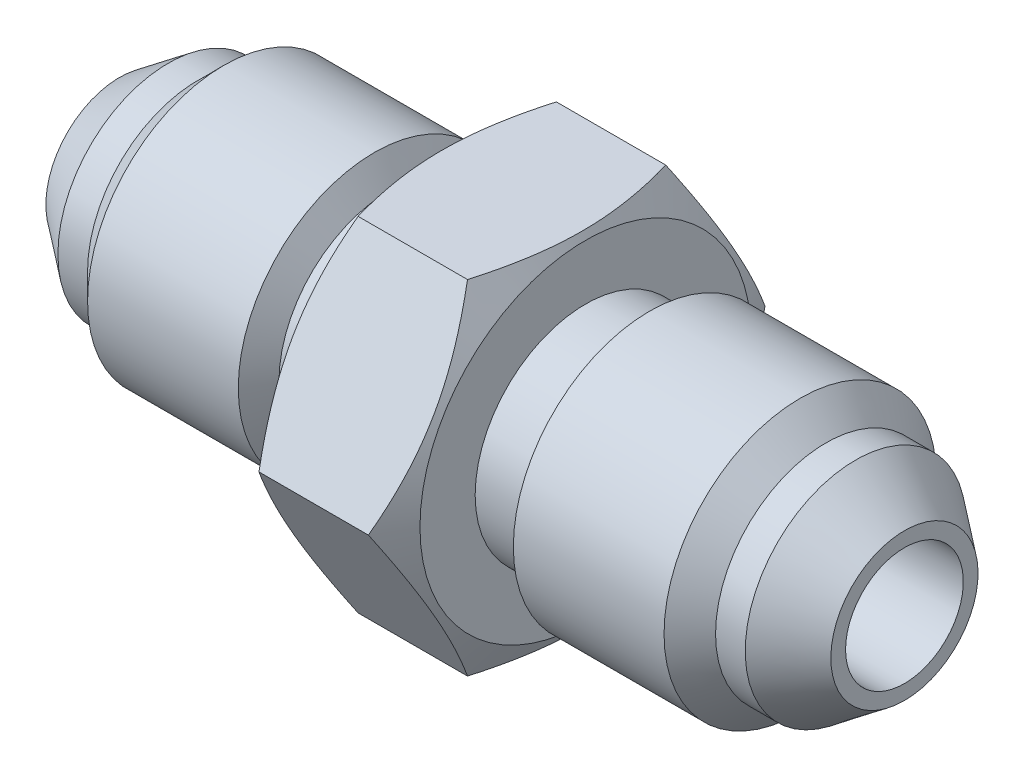
ISO-10303-21;
HEADER;
FILE_DESCRIPTION(('STEP AP214'),'2;1');
FILE_NAME('part.step','',(''),(''),'','','');
FILE_SCHEMA(('AUTOMOTIVE_DESIGN { 1 0 10303 214 1 1 1 1 }'));
ENDSEC;
DATA;
#1=APPLICATION_CONTEXT('core data for automotive mechanical design processes');
#2=APPLICATION_PROTOCOL_DEFINITION('international standard','automotive_design',2000,#1);
#3=PRODUCT_CONTEXT('',#1,'mechanical');
#4=PRODUCT('Part','Part','',(#3));
#5=PRODUCT_RELATED_PRODUCT_CATEGORY('part','',(#4));
#6=PRODUCT_DEFINITION_FORMATION('','',#4);
#7=PRODUCT_DEFINITION_CONTEXT('part definition',#1,'design');
#8=PRODUCT_DEFINITION('design','',#6,#7);
#9=PRODUCT_DEFINITION_SHAPE('','',#8);
#10=(LENGTH_UNIT() NAMED_UNIT(*) SI_UNIT(.MILLI.,.METRE.));
#11=(NAMED_UNIT(*) PLANE_ANGLE_UNIT() SI_UNIT($,.RADIAN.));
#12=(NAMED_UNIT(*) SI_UNIT($,.STERADIAN.) SOLID_ANGLE_UNIT());
#13=UNCERTAINTY_MEASURE_WITH_UNIT(LENGTH_MEASURE(1.E-05),#10,'distance_accuracy_value','');
#14=(GEOMETRIC_REPRESENTATION_CONTEXT(3) GLOBAL_UNCERTAINTY_ASSIGNED_CONTEXT((#13)) GLOBAL_UNIT_ASSIGNED_CONTEXT((#10,
#11,#12)) REPRESENTATION_CONTEXT('',''));
#15=CARTESIAN_POINT('',(0.,0.,0.));
#16=DIRECTION('',(0.,0.,1.));
#17=DIRECTION('',(1.,0.,0.));
#18=AXIS2_PLACEMENT_3D('',#15,#16,#17);
#19=CARTESIAN_POINT('',(16.,0.,8.08290376865476));
#20=DIRECTION('',(0.,0.5,-0.866025403784439));
#21=DIRECTION('',(0.,0.866025403784439,0.5));
#22=AXIS2_PLACEMENT_3D('',#19,#20,#21);
#23=PLANE('',#22);
#24=DIRECTION('',(1.,0.,0.));
#25=VECTOR('',#24,1.);
#26=CARTESIAN_POINT('',(16.,-7.,4.04145188432738));
#27=LINE('',#26,#25);
#28=CARTESIAN_POINT('',(13.7695523370859,-7.,4.04145184102993));
#29=VERTEX_POINT('',#28);
#30=CARTESIAN_POINT('',(18.2304476628624,-6.99999996250659,4.04145190597421));
#31=VERTEX_POINT('',#30);
#32=EDGE_CURVE('E295',#29,#31,#27,.T.);
#33=ORIENTED_EDGE('',*,*,#32,.T.);
#34=CARTESIAN_POINT('',(18.2304476503685,-1.15356977516488E-11,8.0829037686481));
#35=CARTESIAN_POINT('',(18.2817264954627,-0.153866219325046,7.99406906550825));
#36=CARTESIAN_POINT('',(18.3306779235275,-0.308306124341684,7.90490314477328));
#37=CARTESIAN_POINT('',(18.4232849576522,-0.618440130630472,7.72584719275759));
#38=CARTESIAN_POINT('',(18.4669382791793,-0.774134742289358,7.63595686680496));
#39=CARTESIAN_POINT('',(18.5890941562771,-1.24371126709583,7.36484673380281));
#40=CARTESIAN_POINT('',(18.6585739343247,-1.55944669874192,7.18255679734924));
#41=CARTESIAN_POINT('',(18.7400452111364,-2.03193898944481,6.9097632461219));
#42=CARTESIAN_POINT('',(18.7632536331217,-2.18728422905769,6.82007463021408));
#43=CARTESIAN_POINT('',(18.8021698335142,-2.49867653359645,6.64029219936505));
#44=CARTESIAN_POINT('',(18.8178782746178,-2.65472353528444,6.55019842093425));
#45=CARTESIAN_POINT('',(18.8413941802691,-2.96708846991515,6.36985444183981));
#46=CARTESIAN_POINT('',(18.8492106103787,-3.12340589288065,6.27960453561165));
#47=CARTESIAN_POINT('',(18.8567832825349,-3.43617639516258,6.09902640192461));
#48=CARTESIAN_POINT('',(18.8565397736774,-3.59262947013718,6.00869817697248));
#49=CARTESIAN_POINT('',(18.8447946057506,-4.02123301093532,5.76124380731705));
#50=CARTESIAN_POINT('',(18.8250874848616,-4.29324309393085,5.60419871267729));
#51=CARTESIAN_POINT('',(18.7626027747101,-4.83545664107243,5.29115157527683));
#52=CARTESIAN_POINT('',(18.7198038398557,-5.10565819912389,5.13515063300036));
#53=CARTESIAN_POINT('',(18.6128215710911,-5.64896245441752,4.82147377495472));
#54=CARTESIAN_POINT('',(18.5481850796382,-5.92199661615695,4.66383742817649));
#55=CARTESIAN_POINT('',(18.4014873393784,-6.46399382660115,4.35091519282651));
#56=CARTESIAN_POINT('',(18.319460536973,-6.73296381353289,4.19562529846754));
#57=CARTESIAN_POINT('',(18.2304476753599,-6.99999992501401,4.04145192762057));
#58=B_SPLINE_CURVE_WITH_KNOTS('',3,(#34,#35,#36,#37,#38,#39,#40,#41,#42,#43,#44,#45,#46,#47,#48,
#49,#50,#51,#52,#53,#54,#55,#56,#57),.UNSPECIFIED.,.F.,.F.,(4,2,2,2,2,2,2,2,2,2,2,4),(0.,
0.554720009595271,1.10967836987024,2.22190068891676,2.76439120730583,3.30683378249756,
3.84865943088992,4.39046833393637,5.3336024400705,6.27760985712302,7.24255083439344,
8.20559804000231),.UNSPECIFIED.);
#59=CARTESIAN_POINT('',(18.2304476503824,0.,8.08290376862228));
#60=VERTEX_POINT('',#59);
#61=EDGE_CURVE('E97',#60,#31,#58,.T.);
#62=ORIENTED_EDGE('',*,*,#61,.F.);
#63=DIRECTION('',(1.,0.,0.));
#64=VECTOR('',#63,1.);
#65=CARTESIAN_POINT('',(16.,0.,8.08290376865476));
#66=LINE('',#65,#64);
#67=CARTESIAN_POINT('',(13.7695523495787,6.48040305394074E-13,8.08290376864702));
#68=VERTEX_POINT('',#67);
#69=EDGE_CURVE('E41',#60,#68,#66,.F.);
#70=ORIENTED_EDGE('',*,*,#69,.T.);
#71=CARTESIAN_POINT('',(13.7695523592075,-7.00000002886832,4.04145186766026));
#72=CARTESIAN_POINT('',(13.7182735137119,-6.84613380930403,4.13028657094489));
#73=CARTESIAN_POINT('',(13.6693220852363,-6.69169390403535,4.21945249182538));
#74=CARTESIAN_POINT('',(13.5767150502729,-6.38155989723726,4.39850844413511));
#75=CARTESIAN_POINT('',(13.5330617283179,-6.22586528532111,4.48839877023627));
#76=CARTESIAN_POINT('',(13.4109058499072,-5.75628875971213,4.75950890370175));
#77=CARTESIAN_POINT('',(13.3414260709535,-5.44055332750909,4.94179884047687));
#78=CARTESIAN_POINT('',(13.2599547927973,-4.96806103598366,5.2145923921791));
#79=CARTESIAN_POINT('',(13.236746370374,-4.81271579612705,5.30428100822764));
#80=CARTESIAN_POINT('',(13.197830169109,-4.50132349108596,5.4840634393667));
#81=CARTESIAN_POINT('',(13.1821217275709,-4.34527648913936,5.5741572179468));
#82=CARTESIAN_POINT('',(13.1586058210656,-4.03291155397928,5.75450119734687));
#83=CARTESIAN_POINT('',(13.1507893905362,-3.87659413074306,5.84475110373133));
#84=CARTESIAN_POINT('',(13.1432167175647,-3.56382362790359,6.02532923774027));
#85=CARTESIAN_POINT('',(13.1434602260266,-3.40737055264216,6.11565746285801));
#86=CARTESIAN_POINT('',(13.1552053931302,-2.97876700338247,6.36311183739872));
#87=CARTESIAN_POINT('',(13.1749125143184,-2.70675691220732,6.52015693676098));
#88=CARTESIAN_POINT('',(13.237397226455,-2.16454334880752,6.83320408354812));
#89=CARTESIAN_POINT('',(13.2801961629985,-1.89434178267775,6.98920503048861));
#90=CARTESIAN_POINT('',(13.387178436349,-1.35103751101682,7.30288189798392));
#91=CARTESIAN_POINT('',(13.4518149307422,-1.07800334099597,7.46051824954342));
#92=CARTESIAN_POINT('',(13.5985126777315,-0.536006114279575,7.77344049428816));
#93=CARTESIAN_POINT('',(13.6805394839213,-0.267036119356034,7.9287303932612));
#94=CARTESIAN_POINT('',(13.7695523495852,1.29671934576626E-12,8.08290376865551));
#95=B_SPLINE_CURVE_WITH_KNOTS('',3,(#71,#72,#73,#74,#75,#76,#77,#78,#79,#80,#81,#82,#83,#84,#85,
#86,#87,#88,#89,#90,#91,#92,#93,#94),.UNSPECIFIED.,.F.,.F.,(4,2,2,2,2,2,2,2,2,2,2,4),(0.,
0.55472001076405,1.10967837220852,2.22190069366378,2.76439121305882,3.30683378925624,
3.84865943863906,4.39046834267801,5.33360247705425,6.27760992245441,7.24255092955945,
8.20559816478391),.UNSPECIFIED.);
#96=EDGE_CURVE('E135',#29,#68,#95,.T.);
#97=ORIENTED_EDGE('',*,*,#96,.F.);
#98=EDGE_LOOP('',(#33,#62,#70,#97));
#99=FACE_BOUND('',#98,.T.);
#100=ADVANCED_FACE('F16',(#99),#23,.F.);
#101=CARTESIAN_POINT('',(16.,-7.,4.04145188432738));
#102=DIRECTION('',(0.,1.,0.));
#103=DIRECTION('',(0.,0.,1.));
#104=AXIS2_PLACEMENT_3D('',#101,#102,#103);
#105=PLANE('',#104);
#106=DIRECTION('',(1.,0.,0.));
#107=VECTOR('',#106,1.);
#108=CARTESIAN_POINT('',(16.,-7.,-4.04145188432738));
#109=LINE('',#108,#107);
#110=CARTESIAN_POINT('',(13.7695523370863,-6.99999996250471,-4.0414519059753));
#111=VERTEX_POINT('',#110);
#112=CARTESIAN_POINT('',(18.2304476628672,-7.,-4.04145184101723));
#113=VERTEX_POINT('',#112);
#114=EDGE_CURVE('E82',#111,#113,#109,.T.);
#115=ORIENTED_EDGE('',*,*,#114,.T.);
#116=CARTESIAN_POINT('',(18.2304476407473,-7.,4.041451917643));
#117=CARTESIAN_POINT('',(18.281726486238,-7.,3.8637825110881));
#118=CARTESIAN_POINT('',(18.3306779147091,-7.,3.68545066934159));
#119=CARTESIAN_POINT('',(18.4232849496644,-7.,3.32733876475137));
#120=CARTESIAN_POINT('',(18.4669382716158,-7.,3.14755811256381));
#121=CARTESIAN_POINT('',(18.5890941500166,-7.,2.60533784568121));
#122=CARTESIAN_POINT('',(18.658573928966,-7.,2.240757972165));
#123=CARTESIAN_POINT('',(18.7400452071252,-7.,1.6951708687809));
#124=CARTESIAN_POINT('',(18.7632536295521,-7.,1.51579363666973));
#125=CARTESIAN_POINT('',(18.8021698308233,-7.,1.15622877436326));
#126=CARTESIAN_POINT('',(18.817878272364,-7.,0.976041217188774));
#127=CARTESIAN_POINT('',(18.8413941788736,-7.,0.615353258358378));
#128=CARTESIAN_POINT('',(18.8492106094046,-7.,0.434853445573471));
#129=CARTESIAN_POINT('',(18.8567832823775,-7.,0.0736971775237484));
#130=CARTESIAN_POINT('',(18.8565397739155,-7.,-0.106959272727564));
#131=CARTESIAN_POINT('',(18.8447946069862,-7.,-0.601868014509689));
#132=CARTESIAN_POINT('',(18.8250874865452,-7.,-0.915958205928632));
#133=CARTESIAN_POINT('',(18.7626027769315,-7.,-1.54205248501494));
#134=CARTESIAN_POINT('',(18.7198038421662,-7.,-1.85405437171381));
#135=CARTESIAN_POINT('',(18.6128215732497,-7.,-2.48140809217345));
#136=CARTESIAN_POINT('',(18.5481850815444,-7.,-2.7966807879507));
#137=CARTESIAN_POINT('',(18.4014873405155,-7.,-3.42252526302388));
#138=CARTESIAN_POINT('',(18.3194605375947,-7.,-3.73310505389445));
#139=CARTESIAN_POINT('',(18.2304476753697,-7.,-4.04145179770707));
#140=B_SPLINE_CURVE_WITH_KNOTS('',3,(#116,#117,#118,#119,#120,#121,#122,#123,#124,#125,#126,
#127,#128,#129,#130,#131,#132,#133,#134,#135,#136,#137,#138,#139),.UNSPECIFIED.,.F.,.F.,(4,2,2,
2,2,2,2,2,2,2,2,4),(0.,0.554720010718581,1.1096783721175,2.22190069347039,2.76439121290875,
3.3068337891494,3.84865943858057,4.39046834266596,5.33360245509866,6.27760987847407,
7.24255086241014,8.20559807464209),.UNSPECIFIED.);
#141=EDGE_CURVE('E99',#31,#113,#140,.T.);
#142=ORIENTED_EDGE('',*,*,#141,.F.);
#143=ORIENTED_EDGE('',*,*,#32,.F.);
#144=CARTESIAN_POINT('',(13.7695523592066,-7.,-4.04145191765842));
#145=CARTESIAN_POINT('',(13.718273513715,-7.,-3.86378251110321));
#146=CARTESIAN_POINT('',(13.6693220852432,-7.,-3.68545066935638));
#147=CARTESIAN_POINT('',(13.5767150502863,-7.,-3.32733876476546));
#148=CARTESIAN_POINT('',(13.5330617283341,-7.,-3.14755811257754));
#149=CARTESIAN_POINT('',(13.4109058499312,-7.,-2.60533784569376));
#150=CARTESIAN_POINT('',(13.3414260709806,-7.,-2.24075797217667));
#151=CARTESIAN_POINT('',(13.2599547928199,-7.,-1.69517086879128));
#152=CARTESIAN_POINT('',(13.2367463703925,-7.,-1.51579363667976));
#153=CARTESIAN_POINT('',(13.1978301691204,-7.,-1.15622877437255));
#154=CARTESIAN_POINT('',(13.1821217275794,-7.,-0.976041217197687));
#155=CARTESIAN_POINT('',(13.1586058210693,-7.,-0.615353258366522));
#156=CARTESIAN_POINT('',(13.1507893905381,-7.,-0.434853445581225));
#157=CARTESIAN_POINT('',(13.1432167175648,-7.,-0.0736971775307135));
#158=CARTESIAN_POINT('',(13.1434602260267,-7.,0.106959272720997));
#159=CARTESIAN_POINT('',(13.1552053929559,-7.,0.601868014506136));
#160=CARTESIAN_POINT('',(13.1749125133973,-7.,0.915958205927689));
#161=CARTESIAN_POINT('',(13.2373972230124,-7.,1.54205248501914));
#162=CARTESIAN_POINT('',(13.2801961577786,-7.,1.85405437172055));
#163=CARTESIAN_POINT('',(13.3871784266976,-7.,2.4814080921854));
#164=CARTESIAN_POINT('',(13.4518149184045,-7.,2.79668078796532));
#165=CARTESIAN_POINT('',(13.5985126594369,-7.,3.42252526304365));
#166=CARTESIAN_POINT('',(13.6805394623598,-7.,3.73310505391671));
#167=CARTESIAN_POINT('',(13.7695523245867,-7.,4.04145179773171));
#168=B_SPLINE_CURVE_WITH_KNOTS('',3,(#144,#145,#146,#147,#148,#149,#150,#151,#152,#153,#154,
#155,#156,#157,#158,#159,#160,#161,#162,#163,#164,#165,#166,#167),.UNSPECIFIED.,.F.,.F.,(4,2,2,
2,2,2,2,2,2,2,2,4),(0.,0.554720010720157,1.10967837212066,2.22190069347682,2.7643912129164,
3.30683378915827,3.84865943859064,4.39046834267721,5.33360245511775,6.27760987850105,
7.24255086244591,8.20559807468652),.UNSPECIFIED.);
#169=EDGE_CURVE('E91',#111,#29,#168,.T.);
#170=ORIENTED_EDGE('',*,*,#169,.F.);
#171=EDGE_LOOP('',(#115,#142,#143,#170));
#172=FACE_BOUND('',#171,.T.);
#173=ADVANCED_FACE('F145',(#172),#105,.F.);
#174=CARTESIAN_POINT('',(16.,-7.,-4.04145188432738));
#175=DIRECTION('',(0.,0.5,0.866025403784439));
#176=DIRECTION('',(0.,-0.866025403784439,0.5));
#177=AXIS2_PLACEMENT_3D('',#174,#175,#176);
#178=PLANE('',#177);
#179=DIRECTION('',(1.,0.,0.));
#180=VECTOR('',#179,1.);
#181=CARTESIAN_POINT('',(16.,0.,-8.08290376865477));
#182=LINE('',#181,#180);
#183=CARTESIAN_POINT('',(13.7695523495549,-6.47908393741804E-13,-8.08290376862266));
#184=VERTEX_POINT('',#183);
#185=CARTESIAN_POINT('',(18.2304476503608,-5.76637454499392E-12,-8.08290376864331));
#186=VERTEX_POINT('',#185);
#187=EDGE_CURVE('E70',#184,#186,#182,.T.);
#188=ORIENTED_EDGE('',*,*,#187,.T.);
#189=CARTESIAN_POINT('',(18.2304476407503,-7.00000002884298,-4.04145186767488));
#190=CARTESIAN_POINT('',(18.281726486245,-6.84613380927906,-4.1302865709593));
#191=CARTESIAN_POINT('',(18.3306779147196,-6.69169390401076,-4.21945249183957));
#192=CARTESIAN_POINT('',(18.4232849496811,-6.38155989721347,-4.39850844414885));
#193=CARTESIAN_POINT('',(18.4669382716352,-6.22586528529773,-4.48839877024977));
#194=CARTESIAN_POINT('',(18.5890941500432,-5.75628875969009,-4.75950890371447));
#195=CARTESIAN_POINT('',(18.6585739289953,-5.44055332748803,-4.94179884048904));
#196=CARTESIAN_POINT('',(18.7400452071494,-4.96806103596404,-5.21459239219043));
#197=CARTESIAN_POINT('',(18.7632536295721,-4.81271579610785,-5.30428100823873));
#198=CARTESIAN_POINT('',(18.8021698308359,-4.50132349106761,-5.48406343937729));
#199=CARTESIAN_POINT('',(18.8178782723735,-4.34527648912145,-5.57415721795714));
#200=CARTESIAN_POINT('',(18.8413941788779,-4.03291155396228,-5.75450119735669));
#201=CARTESIAN_POINT('',(18.8492106094068,-3.87659413072652,-5.84475110374089));
#202=CARTESIAN_POINT('',(18.8567832823777,-3.56382362788797,-6.02532923774929));
#203=CARTESIAN_POINT('',(18.8565397739155,-3.40737055262701,-6.11565746286676));
#204=CARTESIAN_POINT('',(18.8447946068114,-2.9787670033701,-6.36311183740586));
#205=CARTESIAN_POINT('',(18.8250874856233,-2.70675691219728,-6.52015693676679));
#206=CARTESIAN_POINT('',(18.7626027734875,-2.16454334880205,-6.83320408355129));
#207=CARTESIAN_POINT('',(18.7198038369447,-1.89434178267453,-6.98920503049047));
#208=CARTESIAN_POINT('',(18.6128215635963,-1.35103751101827,-7.30288189798308));
#209=CARTESIAN_POINT('',(18.5481850692045,-1.07800334099981,-7.46051824954121));
#210=CARTESIAN_POINT('',(18.4014873222184,-0.536006114288037,-7.77344049428328));
#211=CARTESIAN_POINT('',(18.3194605160304,-0.267036119366719,-7.92873039325503));
#212=CARTESIAN_POINT('',(18.2304476503685,-1.15335406622005E-11,-8.0829037686481));
#213=B_SPLINE_CURVE_WITH_KNOTS('',3,(#189,#190,#191,#192,#193,#194,#195,#196,#197,#198,#199,
#200,#201,#202,#203,#204,#205,#206,#207,#208,#209,#210,#211,#212),.UNSPECIFIED.,.F.,.F.,(4,2,2,
2,2,2,2,2,2,2,2,4),(0.,0.55472001076201,1.10967837220444,2.22190069365547,2.76439121304886,
3.30683378924462,3.8486594386258,4.39046834266313,5.3336024770314,6.27760992242354,
7.24255092951965,8.20559816473529),.UNSPECIFIED.);
#214=EDGE_CURVE('E157',#113,#186,#213,.T.);
#215=ORIENTED_EDGE('',*,*,#214,.F.);
#216=ORIENTED_EDGE('',*,*,#114,.F.);
#217=CARTESIAN_POINT('',(13.7695523495852,1.29712221933932E-12,-8.08290376865551));
#218=CARTESIAN_POINT('',(13.7182735044902,-0.153866219312472,-7.99406906551552));
#219=CARTESIAN_POINT('',(13.6693220764246,-0.308306124329385,-7.90490314478038));
#220=CARTESIAN_POINT('',(13.5767150422983,-0.618440130618754,-7.72584719276436));
#221=CARTESIAN_POINT('',(13.5330617207705,-0.774134742277946,-7.63595686681155));
#222=CARTESIAN_POINT('',(13.4109058436706,-1.24371126708542,-7.36484673380883));
#223=CARTESIAN_POINT('',(13.3414260656218,-1.55944669873225,-7.18255679735483));
#224=CARTESIAN_POINT('',(13.2599547888085,-2.03193898943623,-6.90976324612686));
#225=CARTESIAN_POINT('',(13.2367463668228,-2.18728422904942,-6.82007463021886));
#226=CARTESIAN_POINT('',(13.1978301664296,-2.49867653358881,-6.64029219936946));
#227=CARTESIAN_POINT('',(13.1821217253256,-2.65472353527713,-6.55019842093848));
#228=CARTESIAN_POINT('',(13.1586058196737,-2.96708846990851,-6.36985444184365));
#229=CARTESIAN_POINT('',(13.1507893895639,-3.12340589287435,-6.2796045356153));
#230=CARTESIAN_POINT('',(13.1432167174074,-3.43617639515695,-6.09902640192786));
#231=CARTESIAN_POINT('',(13.1434602262648,-3.59262947013191,-6.00869817697553));
#232=CARTESIAN_POINT('',(13.1552053941915,-4.02123301093036,-5.76124380731992));
#233=CARTESIAN_POINT('',(13.1749125150806,-4.29324309392586,-5.60419871268017));
#234=CARTESIAN_POINT('',(13.2373972252326,-4.83545664106735,-5.29115157527977));
#235=CARTESIAN_POINT('',(13.2801961600872,-5.10565819911876,-5.13515063300333));
#236=CARTESIAN_POINT('',(13.3871784288528,-5.64896245441235,-4.8214737749577));
#237=CARTESIAN_POINT('',(13.4518149203063,-5.9219966161518,-4.66383742817947));
#238=CARTESIAN_POINT('',(13.5985126605676,-6.46399382659594,-4.35091519282952));
#239=CARTESIAN_POINT('',(13.6805394629737,-6.7329638135276,-4.1956252984706));
#240=CARTESIAN_POINT('',(13.7695523245876,-6.99999992500861,-4.04145192762368));
#241=B_SPLINE_CURVE_WITH_KNOTS('',3,(#217,#218,#219,#220,#221,#222,#223,#224,#225,#226,#227,
#228,#229,#230,#231,#232,#233,#234,#235,#236,#237,#238,#239,#240),.UNSPECIFIED.,.F.,.F.,(4,2,2,
2,2,2,2,2,2,2,2,4),(0.,0.554720009596814,1.10967836987333,2.22190068892304,2.76439120731334,
3.30683378250628,3.84865943089984,4.39046833394748,5.3336024400815,6.27760985713395,
7.24255083440477,8.20559804001399),.UNSPECIFIED.);
#242=EDGE_CURVE('E20',#184,#111,#241,.T.);
#243=ORIENTED_EDGE('',*,*,#242,.F.);
#244=EDGE_LOOP('',(#188,#215,#216,#243));
#245=FACE_BOUND('',#244,.T.);
#246=ADVANCED_FACE('F86',(#245),#178,.F.);
#247=CARTESIAN_POINT('',(16.,0.,-8.08290376865477));
#248=DIRECTION('',(0.,-0.5,0.866025403784439));
#249=DIRECTION('',(0.,-0.866025403784439,-0.5));
#250=AXIS2_PLACEMENT_3D('',#247,#248,#249);
#251=PLANE('',#250);
#252=DIRECTION('',(1.,0.,0.));
#253=VECTOR('',#252,1.);
#254=CARTESIAN_POINT('',(16.,7.,-4.04145188432774));
#255=LINE('',#254,#253);
#256=CARTESIAN_POINT('',(13.7695523370828,7.,-4.04145184101941));
#257=VERTEX_POINT('',#256);
#258=CARTESIAN_POINT('',(18.2304476628679,6.99999996248992,-4.04145190598402));
#259=VERTEX_POINT('',#258);
#260=EDGE_CURVE('E81',#257,#259,#255,.T.);
#261=ORIENTED_EDGE('',*,*,#260,.T.);
#262=CARTESIAN_POINT('',(18.2304476503685,1.15359756411225E-11,-8.08290376864811));
#263=CARTESIAN_POINT('',(18.2817264954627,0.15386621932504,-7.99406906550827));
#264=CARTESIAN_POINT('',(18.3306779235275,0.308306124341674,-7.90490314477329));
#265=CARTESIAN_POINT('',(18.4232849576522,0.618440130630451,-7.72584719275761));
#266=CARTESIAN_POINT('',(18.4669382791793,0.774134742289331,-7.63595686680498));
#267=CARTESIAN_POINT('',(18.5890941562771,1.24371126709579,-7.36484673380285));
#268=CARTESIAN_POINT('',(18.6585739343247,1.55944669874186,-7.18255679734928));
#269=CARTESIAN_POINT('',(18.7400452111364,2.03193898944474,-6.90976324612195));
#270=CARTESIAN_POINT('',(18.7632536331217,2.18728422905764,-6.82007463021412));
#271=CARTESIAN_POINT('',(18.8021698335142,2.49867653359641,-6.64029219936508));
#272=CARTESIAN_POINT('',(18.8178782746178,2.6547235352844,-6.55019842093428));
#273=CARTESIAN_POINT('',(18.8413941802691,2.96708846991513,-6.36985444183984));
#274=CARTESIAN_POINT('',(18.8492106103787,3.12340589288063,-6.27960453561167));
#275=CARTESIAN_POINT('',(18.8567832825349,3.43617639516257,-6.09902640192462));
#276=CARTESIAN_POINT('',(18.8565397736774,3.59262947013718,-6.00869817697248));
#277=CARTESIAN_POINT('',(18.8447946057507,4.02123301093244,-5.76124380731871));
#278=CARTESIAN_POINT('',(18.825087484862,4.29324309392508,-5.60419871268062));
#279=CARTESIAN_POINT('',(18.7626027747116,4.83545664106095,-5.29115157528347));
#280=CARTESIAN_POINT('',(18.7198038398581,5.10565819910958,-5.13515063300863));
#281=CARTESIAN_POINT('',(18.6128215710955,5.64896245439748,-4.82147377496629));
#282=CARTESIAN_POINT('',(18.5481850796439,5.92199661613402,-4.66383742818974));
#283=CARTESIAN_POINT('',(18.4014873393867,6.46399382657253,-4.35091519284304));
#284=CARTESIAN_POINT('',(18.3194605369829,6.73296381350147,-4.19562529848569));
#285=CARTESIAN_POINT('',(18.2304476753713,6.99999992497984,-4.04145192764029));
#286=B_SPLINE_CURVE_WITH_KNOTS('',3,(#262,#263,#264,#265,#266,#267,#268,#269,#270,#271,#272,
#273,#274,#275,#276,#277,#278,#279,#280,#281,#282,#283,#284,#285),.UNSPECIFIED.,.F.,.F.,(4,2,2,
2,2,2,2,2,2,2,2,4),(0.,0.554720009595252,1.1096783698702,2.22190068891667,2.76439120730577,
3.30683378249751,3.84865943088991,4.39046833393638,5.33360244006051,6.277609857103,
7.24255083436287,8.20559803996126),.UNSPECIFIED.);
#287=EDGE_CURVE('E78',#186,#259,#286,.T.);
#288=ORIENTED_EDGE('',*,*,#287,.F.);
#289=ORIENTED_EDGE('',*,*,#187,.F.);
#290=CARTESIAN_POINT('',(13.7695523592011,7.00000002884908,-4.04145186767137));
#291=CARTESIAN_POINT('',(13.7182735137057,6.84613380928495,-4.13028657095591));
#292=CARTESIAN_POINT('',(13.6693220852304,6.69169390401643,-4.21945249183631));
#293=CARTESIAN_POINT('',(13.5767150502676,6.38155989721866,-4.39850844414586));
#294=CARTESIAN_POINT('',(13.5330617283128,6.22586528530267,-4.48839877024693));
#295=CARTESIAN_POINT('',(13.4109058499031,5.7562887596942,-4.75950890371211));
#296=CARTESIAN_POINT('',(13.3414260709499,5.44055332749151,-4.94179884048703));
#297=CARTESIAN_POINT('',(13.2599547927946,4.96806103596662,-5.21459239218895));
#298=CARTESIAN_POINT('',(13.2367463703716,4.81271579611018,-5.30428100823739));
#299=CARTESIAN_POINT('',(13.1978301691072,4.50132349106944,-5.48406343937624));
#300=CARTESIAN_POINT('',(13.1821217275693,4.34527648912302,-5.57415721795624));
#301=CARTESIAN_POINT('',(13.1586058210647,4.03291155396331,-5.7545011973561));
#302=CARTESIAN_POINT('',(13.1507893905356,3.87659413072728,-5.84475110374045));
#303=CARTESIAN_POINT('',(13.1432167175646,3.5638236278882,-6.02532923774917));
#304=CARTESIAN_POINT('',(13.1434602260267,3.40737055262697,-6.11565746286678));
#305=CARTESIAN_POINT('',(13.155205393131,2.9787670033687,-6.36311183740666));
#306=CARTESIAN_POINT('',(13.1749125143195,2.7067569121948,-6.52015693676822));
#307=CARTESIAN_POINT('',(13.2373972264565,2.16454334879748,-6.83320408355393));
#308=CARTESIAN_POINT('',(13.2801961630001,1.89434178266894,-6.9892050304937));
#309=CARTESIAN_POINT('',(13.3871784363504,1.35103751101054,-7.30288189798755));
#310=CARTESIAN_POINT('',(13.4518149307435,1.07800334099097,-7.46051824954632));
#311=CARTESIAN_POINT('',(13.5985126777323,0.536006114277108,-7.7734404942896));
#312=CARTESIAN_POINT('',(13.6805394839217,0.267036119354811,-7.92873039326192));
#313=CARTESIAN_POINT('',(13.7695523495852,-1.29613152601982E-12,-8.08290376865552));
#314=B_SPLINE_CURVE_WITH_KNOTS('',3,(#290,#291,#292,#293,#294,#295,#296,#297,#298,#299,#300,
#301,#302,#303,#304,#305,#306,#307,#308,#309,#310,#311,#312,#313),.UNSPECIFIED.,.F.,.F.,(4,2,2,
2,2,2,2,2,2,2,2,4),(0.,0.5547200107633,1.10967837220703,2.22190069366074,2.76439121305509,
3.30683378925181,3.84865943863393,4.39046834267219,5.33360247704423,6.27760992244017,
7.24255092954076,8.20559816476079),.UNSPECIFIED.);
#315=EDGE_CURVE('E75',#257,#184,#314,.T.);
#316=ORIENTED_EDGE('',*,*,#315,.F.);
#317=EDGE_LOOP('',(#261,#288,#289,#316));
#318=FACE_BOUND('',#317,.T.);
#319=ADVANCED_FACE('F73',(#318),#251,.F.);
#320=CARTESIAN_POINT('',(16.,7.,-4.04145188432738));
#321=DIRECTION('',(0.,-1.,0.));
#322=DIRECTION('',(0.,0.,-1.));
#323=AXIS2_PLACEMENT_3D('',#320,#321,#322);
#324=PLANE('',#323);
#325=DIRECTION('',(1.,0.,0.));
#326=VECTOR('',#325,1.);
#327=CARTESIAN_POINT('',(16.,7.,4.04145188432738));
#328=LINE('',#327,#326);
#329=CARTESIAN_POINT('',(13.7695523370828,6.99999996249425,4.04145190598134));
#330=VERTEX_POINT('',#329);
#331=CARTESIAN_POINT('',(18.2304476628674,7.,4.04145184101661));
#332=VERTEX_POINT('',#331);
#333=EDGE_CURVE('E300',#330,#332,#328,.T.);
#334=ORIENTED_EDGE('',*,*,#333,.T.);
#335=CARTESIAN_POINT('',(18.2304476407487,7.,-4.04145191763787));
#336=CARTESIAN_POINT('',(18.2817264862394,7.,-3.86378251108301));
#337=CARTESIAN_POINT('',(18.3306779147104,7.,-3.68545066933655));
#338=CARTESIAN_POINT('',(18.4232849496656,7.,-3.32733876474641));
#339=CARTESIAN_POINT('',(18.466938271617,7.,-3.14755811255889));
#340=CARTESIAN_POINT('',(18.5890941500176,7.,-2.60533784567643));
#341=CARTESIAN_POINT('',(18.6585739289668,7.,-2.24075797216032));
#342=CARTESIAN_POINT('',(18.7400452071258,7.,-1.69517086877636));
#343=CARTESIAN_POINT('',(18.7632536295526,7.,-1.51579363666523));
#344=CARTESIAN_POINT('',(18.8021698308238,7.,-1.15622877435885));
#345=CARTESIAN_POINT('',(18.8178782723644,7.,-0.97604121718442));
#346=CARTESIAN_POINT('',(18.8413941788738,7.,-0.615353258354122));
#347=CARTESIAN_POINT('',(18.8492106094047,7.,-0.434853445569266));
#348=CARTESIAN_POINT('',(18.8567832823776,7.,-0.0736971775196463));
#349=CARTESIAN_POINT('',(18.8565397739154,7.,0.106959272731613));
#350=CARTESIAN_POINT('',(18.844794606986,7.,0.601868014513254));
#351=CARTESIAN_POINT('',(18.8250874865449,7.,0.915958205931764));
#352=CARTESIAN_POINT('',(18.7626027769312,7.,1.54205248501721));
#353=CARTESIAN_POINT('',(18.7198038421659,7.,1.85405437171564));
#354=CARTESIAN_POINT('',(18.6128215732495,7.,2.4814080921744));
#355=CARTESIAN_POINT('',(18.5481850815443,7.,2.7966807879512));
#356=CARTESIAN_POINT('',(18.4014873405156,7.,3.4225252630235));
#357=CARTESIAN_POINT('',(18.3194605375949,7.,3.73310505389365));
#358=CARTESIAN_POINT('',(18.2304476753701,7.,4.04145179770583));
#359=B_SPLINE_CURVE_WITH_KNOTS('',3,(#335,#336,#337,#338,#339,#340,#341,#342,#343,#344,#345,
#346,#347,#348,#349,#350,#351,#352,#353,#354,#355,#356,#357,#358),.UNSPECIFIED.,.F.,.F.,(4,2,2,
2,2,2,2,2,2,2,2,4),(0.,0.55472001071841,1.10967837211716,2.22190069346969,2.76439121290789,
3.30683378914838,3.84865943857939,4.39046834266462,5.33360245509603,6.27760987847015,
7.24255086240487,8.20559807463547),.UNSPECIFIED.);
#360=EDGE_CURVE('E169',#259,#332,#359,.T.);
#361=ORIENTED_EDGE('',*,*,#360,.F.);
#362=ORIENTED_EDGE('',*,*,#260,.F.);
#363=CARTESIAN_POINT('',(13.769552359201,7.,4.04145191763897));
#364=CARTESIAN_POINT('',(13.7182735137097,7.,3.86378251108392));
#365=CARTESIAN_POINT('',(13.669322085238,7.,3.68545066933726));
#366=CARTESIAN_POINT('',(13.5767150502817,7.,3.32733876474668));
#367=CARTESIAN_POINT('',(13.5330617283297,7.,3.14755811255892));
#368=CARTESIAN_POINT('',(13.4109058499276,7.,2.60533784567566));
#369=CARTESIAN_POINT('',(13.3414260709774,7.,2.24075797215893));
#370=CARTESIAN_POINT('',(13.2599547928175,7.,1.69517086877409));
#371=CARTESIAN_POINT('',(13.2367463703904,7.,1.51579363666274));
#372=CARTESIAN_POINT('',(13.1978301691189,7.,1.15622877435588));
#373=CARTESIAN_POINT('',(13.1821217275781,7.,0.976041217181199));
#374=CARTESIAN_POINT('',(13.1586058210685,7.,0.615353258350401));
#375=CARTESIAN_POINT('',(13.1507893905375,7.,0.434853445565292));
#376=CARTESIAN_POINT('',(13.1432167175647,7.,0.0736971775151664));
#377=CARTESIAN_POINT('',(13.1434602260269,7.,-0.106959272736346));
#378=CARTESIAN_POINT('',(13.1552053929566,7.,-0.601868014518302));
#379=CARTESIAN_POINT('',(13.1749125133981,7.,-0.915958205936865));
#380=CARTESIAN_POINT('',(13.2373972230128,7.,-1.54205248502236));
#381=CARTESIAN_POINT('',(13.2801961577787,7.,-1.8540543717208));
#382=CARTESIAN_POINT('',(13.3871784266965,7.,-2.48140809217964));
#383=CARTESIAN_POINT('',(13.4518149184027,7.,-2.79668078795652));
#384=CARTESIAN_POINT('',(13.5985126594333,7.,-3.42252526302886));
#385=CARTESIAN_POINT('',(13.680539462355,7.,-3.73310505389897));
#386=CARTESIAN_POINT('',(13.7695523245808,7.,-4.04145179771107));
#387=B_SPLINE_CURVE_WITH_KNOTS('',3,(#363,#364,#365,#366,#367,#368,#369,#370,#371,#372,#373,
#374,#375,#376,#377,#378,#379,#380,#381,#382,#383,#384,#385,#386),.UNSPECIFIED.,.F.,.F.,(4,2,2,
2,2,2,2,2,2,2,2,4),(0.,0.554720010719493,1.10967837211933,2.22190069347412,2.7643912129131,
3.30683378915437,3.84865943858614,4.39046834267212,5.33360245510375,6.27760987847811,
7.24255086241355,8.20559807464482),.UNSPECIFIED.);
#388=EDGE_CURVE('E96',#330,#257,#387,.T.);
#389=ORIENTED_EDGE('',*,*,#388,.F.);
#390=EDGE_LOOP('',(#334,#361,#362,#389));
#391=FACE_BOUND('',#390,.T.);
#392=ADVANCED_FACE('F181',(#391),#324,.F.);
#393=CARTESIAN_POINT('',(16.,7.,4.04145188432738));
#394=DIRECTION('',(0.,-0.5,-0.866025403784439));
#395=DIRECTION('',(0.,0.866025403784439,-0.5));
#396=AXIS2_PLACEMENT_3D('',#393,#394,#395);
#397=PLANE('',#396);
#398=ORIENTED_EDGE('',*,*,#69,.F.);
#399=CARTESIAN_POINT('',(18.23044764075,7.00000002884405,4.04145186767426));
#400=CARTESIAN_POINT('',(18.2817264862446,6.84613380928012,4.13028657095869));
#401=CARTESIAN_POINT('',(18.3306779147193,6.69169390401181,4.21945249183897));
#402=CARTESIAN_POINT('',(18.4232849496808,6.3815598972145,4.39850844414825));
#403=CARTESIAN_POINT('',(18.4669382716349,6.22586528529876,4.48839877024918));
#404=CARTESIAN_POINT('',(18.589094150043,5.75628875969109,4.7595089037139));
#405=CARTESIAN_POINT('',(18.6585739289951,5.440553327489,4.94179884048847));
#406=CARTESIAN_POINT('',(18.7400452071492,4.96806103596499,5.21459239218989));
#407=CARTESIAN_POINT('',(18.7632536295719,4.81271579610878,5.30428100823819));
#408=CARTESIAN_POINT('',(18.8021698308358,4.50132349106853,5.48406343937676));
#409=CARTESIAN_POINT('',(18.8178782723734,4.34527648912236,5.57415721795662));
#410=CARTESIAN_POINT('',(18.8413941788778,4.03291155396316,5.75450119735618));
#411=CARTESIAN_POINT('',(18.8492106094068,3.87659413072739,5.84475110374038));
#412=CARTESIAN_POINT('',(18.8567832823777,3.56382362788883,6.0253292377488));
#413=CARTESIAN_POINT('',(18.8565397739156,3.40737055262785,6.11565746286627));
#414=CARTESIAN_POINT('',(18.8447946068115,2.97876700337086,6.36311183740542));
#415=CARTESIAN_POINT('',(18.8250874856234,2.70675691219797,6.52015693676638));
#416=CARTESIAN_POINT('',(18.7626027734876,2.16454334880261,6.83320408355096));
#417=CARTESIAN_POINT('',(18.7198038369448,1.89434178267503,6.98920503049018));
#418=CARTESIAN_POINT('',(18.6128215635964,1.35103751101862,7.30288189798288));
#419=CARTESIAN_POINT('',(18.5481850692045,1.07800334100009,7.46051824954105));
#420=CARTESIAN_POINT('',(18.4014873222184,0.536006114288173,7.7734404942832));
#421=CARTESIAN_POINT('',(18.3194605160304,0.267036119366785,7.92873039325499));
#422=CARTESIAN_POINT('',(18.2304476503685,1.15317161495098E-11,8.0829037686481));
#423=B_SPLINE_CURVE_WITH_KNOTS('',3,(#399,#400,#401,#402,#403,#404,#405,#406,#407,#408,#409,
#410,#411,#412,#413,#414,#415,#416,#417,#418,#419,#420,#421,#422),.UNSPECIFIED.,.F.,.F.,(4,2,2,
2,2,2,2,2,2,2,2,4),(0.,0.554720010762051,1.10967837220452,2.22190069365564,2.76439121304907,
3.30683378924487,3.84865943862609,4.39046834266345,5.33360247703196,6.27760992242433,
7.24255092952069,8.20559816473658),.UNSPECIFIED.);
#424=EDGE_CURVE('E175',#332,#60,#423,.T.);
#425=ORIENTED_EDGE('',*,*,#424,.F.);
#426=ORIENTED_EDGE('',*,*,#333,.F.);
#427=CARTESIAN_POINT('',(13.7695523495852,-1.2986827048557E-12,8.08290376865551));
#428=CARTESIAN_POINT('',(13.7182735044902,0.153866219312468,7.99406906551552));
#429=CARTESIAN_POINT('',(13.6693220764246,0.308306124329377,7.90490314478039));
#430=CARTESIAN_POINT('',(13.5767150422983,0.61844013061874,7.72584719276437));
#431=CARTESIAN_POINT('',(13.5330617207705,0.774134742277929,7.63595686681156));
#432=CARTESIAN_POINT('',(13.4109058436706,1.24371126708539,7.36484673380884));
#433=CARTESIAN_POINT('',(13.3414260656218,1.55944669873221,7.18255679735485));
#434=CARTESIAN_POINT('',(13.2599547888085,2.03193898943619,6.90976324612689));
#435=CARTESIAN_POINT('',(13.2367463668229,2.18728422904938,6.82007463021888));
#436=CARTESIAN_POINT('',(13.1978301664296,2.49867653358878,6.64029219936948));
#437=CARTESIAN_POINT('',(13.1821217253256,2.65472353527711,6.55019842093849));
#438=CARTESIAN_POINT('',(13.1586058196737,2.96708846990849,6.36985444184366));
#439=CARTESIAN_POINT('',(13.1507893895639,3.12340589287433,6.27960453561531));
#440=CARTESIAN_POINT('',(13.1432167174074,3.43617639515695,6.09902640192786));
#441=CARTESIAN_POINT('',(13.1434602262648,3.5926294701319,6.00869817697553));
#442=CARTESIAN_POINT('',(13.1552053941915,4.02123301092866,5.7612438073209));
#443=CARTESIAN_POINT('',(13.1749125150804,4.29324309392246,5.60419871268213));
#444=CARTESIAN_POINT('',(13.2373972252316,4.83545664106059,5.29115157528367));
#445=CARTESIAN_POINT('',(13.2801961600858,5.10565819911033,5.13515063300819));
#446=CARTESIAN_POINT('',(13.3871784288502,5.64896245440055,4.82147377496452));
#447=CARTESIAN_POINT('',(13.451814920303,5.92199661613829,4.66383742818727));
#448=CARTESIAN_POINT('',(13.5985126605626,6.46399382657908,4.35091519283925));
#449=CARTESIAN_POINT('',(13.6805394629679,6.7329638135091,4.19562529848128));
#450=CARTESIAN_POINT('',(13.7695523245809,6.99999992498849,4.0414519276353));
#451=B_SPLINE_CURVE_WITH_KNOTS('',3,(#427,#428,#429,#430,#431,#432,#433,#434,#435,#436,#437,
#438,#439,#440,#441,#442,#443,#444,#445,#446,#447,#448,#449,#450),.UNSPECIFIED.,.F.,.F.,(4,2,2,
2,2,2,2,2,2,2,2,4),(0.,0.554720009596802,1.10967836987331,2.22190068892299,2.7643912073133,
3.30683378250625,3.84865943089983,4.39046833394748,5.33360244007562,6.27760985712216,
7.24255083438677,8.20559803998982),.UNSPECIFIED.);
#452=EDGE_CURVE('E101',#68,#330,#451,.T.);
#453=ORIENTED_EDGE('',*,*,#452,.F.);
#454=EDGE_LOOP('',(#398,#425,#426,#453));
#455=FACE_BOUND('',#454,.T.);
#456=ADVANCED_FACE('F125',(#455),#397,.F.);
#457=CARTESIAN_POINT('',(13.7741696636908,0.,0.));
#458=DIRECTION('',(1.,0.,0.));
#459=DIRECTION('',(0.,0.,-1.));
#460=AXIS2_PLACEMENT_3D('',#457,#458,#459);
#461=CONICAL_SURFACE('',#460,8.09090119128086,1.04719755119076);
#462=CARTESIAN_POINT('',(12.9999999999768,0.,0.));
#463=DIRECTION('',(1.,0.,0.));
#464=DIRECTION('',(0.,0.,-1.));
#465=AXIS2_PLACEMENT_3D('',#462,#463,#464);
#466=CIRCLE('',#465,6.75000000006776);
#467=CARTESIAN_POINT('',(12.9999999999768,0.,-6.75000000006776));
#468=VERTEX_POINT('',#467);
#469=EDGE_CURVE('E276',#468,#468,#466,.T.);
#470=ORIENTED_EDGE('',*,*,#469,.T.);
#471=EDGE_LOOP('',(#470));
#472=FACE_BOUND('',#471,.T.);
#473=ORIENTED_EDGE('',*,*,#388,.T.);
#474=ORIENTED_EDGE('',*,*,#315,.T.);
#475=ORIENTED_EDGE('',*,*,#242,.T.);
#476=ORIENTED_EDGE('',*,*,#169,.T.);
#477=ORIENTED_EDGE('',*,*,#96,.T.);
#478=ORIENTED_EDGE('',*,*,#452,.T.);
#479=EDGE_LOOP('',(#473,#474,#475,#476,#477,#478));
#480=FACE_BOUND('',#479,.T.);
#481=ADVANCED_FACE('F93',(#472,#480),#461,.T.);
#482=CARTESIAN_POINT('',(18.2258303362915,0.,0.));
#483=DIRECTION('',(-1.,0.,0.));
#484=DIRECTION('',(0.,0.,1.));
#485=AXIS2_PLACEMENT_3D('',#482,#483,#484);
#486=CONICAL_SURFACE('',#485,8.09090119122402,1.04719755119568);
#487=ORIENTED_EDGE('',*,*,#214,.T.);
#488=ORIENTED_EDGE('',*,*,#287,.T.);
#489=ORIENTED_EDGE('',*,*,#360,.T.);
#490=ORIENTED_EDGE('',*,*,#424,.T.);
#491=ORIENTED_EDGE('',*,*,#61,.T.);
#492=ORIENTED_EDGE('',*,*,#141,.T.);
#493=EDGE_LOOP('',(#487,#488,#489,#490,#491,#492));
#494=FACE_BOUND('',#493,.T.);
#495=CARTESIAN_POINT('',(19.0000000000295,0.,0.));
#496=DIRECTION('',(-1.,0.,0.));
#497=DIRECTION('',(0.,0.,1.));
#498=AXIS2_PLACEMENT_3D('',#495,#496,#497);
#499=CIRCLE('',#498,6.74999999995407);
#500=CARTESIAN_POINT('',(19.0000000000295,0.,6.74999999995407));
#501=VERTEX_POINT('',#500);
#502=EDGE_CURVE('E277',#501,#501,#499,.T.);
#503=ORIENTED_EDGE('',*,*,#502,.T.);
#504=EDGE_LOOP('',(#503));
#505=FACE_BOUND('',#504,.T.);
#506=ADVANCED_FACE('F124',(#494,#505),#486,.T.);
#507=CARTESIAN_POINT('',(13.,0.,-8.08290376865477));
#508=DIRECTION('',(1.,0.,0.));
#509=DIRECTION('',(0.,0.,-1.));
#510=AXIS2_PLACEMENT_3D('',#507,#508,#509);
#511=PLANE('',#510);
#512=CARTESIAN_POINT('',(13.,0.,0.));
#513=DIRECTION('',(1.,0.,0.));
#514=DIRECTION('',(0.,0.,-1.));
#515=AXIS2_PLACEMENT_3D('',#512,#513,#514);
#516=CIRCLE('',#515,4.5);
#517=CARTESIAN_POINT('',(13.,0.,-4.5));
#518=VERTEX_POINT('',#517);
#519=EDGE_CURVE('E273',#518,#518,#516,.F.);
#520=ORIENTED_EDGE('',*,*,#519,.F.);
#521=EDGE_LOOP('',(#520));
#522=FACE_BOUND('',#521,.T.);
#523=ORIENTED_EDGE('',*,*,#469,.F.);
#524=EDGE_LOOP('',(#523));
#525=FACE_BOUND('',#524,.T.);
#526=ADVANCED_FACE('F261',(#522,#525),#511,.F.);
#527=CARTESIAN_POINT('',(19.,0.,-8.08290376865477));
#528=DIRECTION('',(-1.,0.,0.));
#529=DIRECTION('',(0.,0.,1.));
#530=AXIS2_PLACEMENT_3D('',#527,#528,#529);
#531=PLANE('',#530);
#532=CARTESIAN_POINT('',(19.,0.,0.));
#533=DIRECTION('',(-1.,0.,0.));
#534=DIRECTION('',(0.,0.,1.));
#535=AXIS2_PLACEMENT_3D('',#532,#533,#534);
#536=CIRCLE('',#535,4.5);
#537=CARTESIAN_POINT('',(19.,0.,4.5));
#538=VERTEX_POINT('',#537);
#539=EDGE_CURVE('E282',#538,#538,#536,.F.);
#540=ORIENTED_EDGE('',*,*,#539,.F.);
#541=EDGE_LOOP('',(#540));
#542=FACE_BOUND('',#541,.T.);
#543=ORIENTED_EDGE('',*,*,#502,.F.);
#544=EDGE_LOOP('',(#543));
#545=FACE_BOUND('',#544,.T.);
#546=ADVANCED_FACE('F258',(#542,#545),#531,.F.);
#547=CARTESIAN_POINT('',(11.,0.,0.));
#548=DIRECTION('',(1.,0.,0.));
#549=DIRECTION('',(0.,0.,-1.));
#550=AXIS2_PLACEMENT_3D('',#547,#548,#549);
#551=CYLINDRICAL_SURFACE('',#550,4.5);
#552=ORIENTED_EDGE('',*,*,#519,.T.);
#553=EDGE_LOOP('',(#552));
#554=FACE_BOUND('',#553,.T.);
#555=CARTESIAN_POINT('',(11.0000000000241,0.,0.));
#556=DIRECTION('',(-1.,0.,0.));
#557=DIRECTION('',(0.,0.,-1.));
#558=AXIS2_PLACEMENT_3D('',#555,#556,#557);
#559=CIRCLE('',#558,4.50000000006412);
#560=CARTESIAN_POINT('',(11.0000000000241,0.,-4.50000000006412));
#561=VERTEX_POINT('',#560);
#562=EDGE_CURVE('E285',#561,#561,#559,.T.);
#563=ORIENTED_EDGE('',*,*,#562,.F.);
#564=EDGE_LOOP('',(#563));
#565=FACE_BOUND('',#564,.T.);
#566=ADVANCED_FACE('F254',(#554,#565),#551,.T.);
#567=CARTESIAN_POINT('',(21.,0.,0.));
#568=DIRECTION('',(-1.,0.,0.));
#569=DIRECTION('',(0.,0.,1.));
#570=AXIS2_PLACEMENT_3D('',#567,#568,#569);
#571=CYLINDRICAL_SURFACE('',#570,4.5);
#572=CARTESIAN_POINT('',(21.000000000015,0.,0.));
#573=DIRECTION('',(1.,0.,0.));
#574=DIRECTION('',(0.,0.,-1.));
#575=AXIS2_PLACEMENT_3D('',#572,#573,#574);
#576=CIRCLE('',#575,4.49999999995043);
#577=CARTESIAN_POINT('',(21.000000000015,0.,-4.49999999995043));
#578=VERTEX_POINT('',#577);
#579=EDGE_CURVE('E305',#578,#578,#576,.T.);
#580=ORIENTED_EDGE('',*,*,#579,.F.);
#581=EDGE_LOOP('',(#580));
#582=FACE_BOUND('',#581,.T.);
#583=ORIENTED_EDGE('',*,*,#539,.T.);
#584=EDGE_LOOP('',(#583));
#585=FACE_BOUND('',#584,.T.);
#586=ADVANCED_FACE('F250',(#582,#585),#571,.T.);
#587=CARTESIAN_POINT('',(10.3937822174203,0.,0.));
#588=DIRECTION('',(-1.,0.,0.));
#589=DIRECTION('',(0.,0.,1.));
#590=AXIS2_PLACEMENT_3D('',#587,#588,#589);
#591=CONICAL_SURFACE('',#590,5.54999999997108,1.04719755119057);
#592=ORIENTED_EDGE('',*,*,#562,.T.);
#593=EDGE_LOOP('',(#592));
#594=FACE_BOUND('',#593,.T.);
#595=CARTESIAN_POINT('',(10.3937822173509,0.,0.));
#596=DIRECTION('',(-1.,0.,0.));
#597=DIRECTION('',(0.,0.,1.));
#598=AXIS2_PLACEMENT_3D('',#595,#596,#597);
#599=CIRCLE('',#598,5.55);
#600=CARTESIAN_POINT('',(10.3937822173509,0.,5.55));
#601=VERTEX_POINT('',#600);
#602=EDGE_CURVE('E308',#601,#601,#599,.T.);
#603=ORIENTED_EDGE('',*,*,#602,.F.);
#604=EDGE_LOOP('',(#603));
#605=FACE_BOUND('',#604,.T.);
#606=ADVANCED_FACE('F246',(#594,#605),#591,.T.);
#607=CARTESIAN_POINT('',(21.606217782562,0.,0.));
#608=DIRECTION('',(1.,0.,0.));
#609=DIRECTION('',(0.,0.,-1.));
#610=AXIS2_PLACEMENT_3D('',#607,#608,#609);
#611=CONICAL_SURFACE('',#610,5.54999999980055,1.04719755119685);
#612=CARTESIAN_POINT('',(21.6062177826491,0.,0.));
#613=DIRECTION('',(1.,0.,0.));
#614=DIRECTION('',(0.,0.,-1.));
#615=AXIS2_PLACEMENT_3D('',#612,#613,#614);
#616=CIRCLE('',#615,5.55);
#617=CARTESIAN_POINT('',(21.6062177826491,0.,-5.55));
#618=VERTEX_POINT('',#617);
#619=EDGE_CURVE('E311',#618,#618,#616,.T.);
#620=ORIENTED_EDGE('',*,*,#619,.F.);
#621=EDGE_LOOP('',(#620));
#622=FACE_BOUND('',#621,.T.);
#623=ORIENTED_EDGE('',*,*,#579,.T.);
#624=EDGE_LOOP('',(#623));
#625=FACE_BOUND('',#624,.T.);
#626=ADVANCED_FACE('F242',(#622,#625),#611,.T.);
#627=CARTESIAN_POINT('',(13.,0.,0.));
#628=DIRECTION('',(-1.,0.,0.));
#629=DIRECTION('',(0.,0.,1.));
#630=AXIS2_PLACEMENT_3D('',#627,#628,#629);
#631=CYLINDRICAL_SURFACE('',#630,5.55);
#632=CARTESIAN_POINT('',(4.25000000001319,0.,0.));
#633=DIRECTION('',(1.,0.,0.));
#634=DIRECTION('',(0.,0.,1.));
#635=AXIS2_PLACEMENT_3D('',#632,#633,#634);
#636=CIRCLE('',#635,5.55000000008477);
#637=CARTESIAN_POINT('',(4.25000000001319,0.,5.55000000008477));
#638=VERTEX_POINT('',#637);
#639=EDGE_CURVE('E314',#638,#638,#636,.F.);
#640=ORIENTED_EDGE('',*,*,#639,.F.);
#641=EDGE_LOOP('',(#640));
#642=FACE_BOUND('',#641,.T.);
#643=ORIENTED_EDGE('',*,*,#602,.T.);
#644=EDGE_LOOP('',(#643));
#645=FACE_BOUND('',#644,.T.);
#646=ADVANCED_FACE('F238',(#642,#645),#631,.T.);
#647=CARTESIAN_POINT('',(19.,0.,0.));
#648=DIRECTION('',(1.,0.,0.));
#649=DIRECTION('',(0.,0.,-1.));
#650=AXIS2_PLACEMENT_3D('',#647,#648,#649);
#651=CYLINDRICAL_SURFACE('',#650,5.55);
#652=ORIENTED_EDGE('',*,*,#619,.T.);
#653=EDGE_LOOP('',(#652));
#654=FACE_BOUND('',#653,.T.);
#655=CARTESIAN_POINT('',(27.7500000000259,0.,0.));
#656=DIRECTION('',(-1.,0.,0.));
#657=DIRECTION('',(0.,0.,1.));
#658=AXIS2_PLACEMENT_3D('',#655,#656,#657);
#659=CIRCLE('',#658,5.54999999997108);
#660=CARTESIAN_POINT('',(27.7500000000259,0.,5.54999999997108));
#661=VERTEX_POINT('',#660);
#662=EDGE_CURVE('E317',#661,#661,#659,.F.);
#663=ORIENTED_EDGE('',*,*,#662,.F.);
#664=EDGE_LOOP('',(#663));
#665=FACE_BOUND('',#664,.T.);
#666=ADVANCED_FACE('F234',(#654,#665),#651,.T.);
#667=CARTESIAN_POINT('',(4.25000000001319,0.,0.));
#668=DIRECTION('',(1.,0.,0.));
#669=DIRECTION('',(0.,0.,-1.));
#670=AXIS2_PLACEMENT_3D('',#667,#668,#669);
#671=CONICAL_SURFACE('',#670,5.55000000008477,0.785398163397448);
#672=CARTESIAN_POINT('',(3.2,0.,0.));
#673=DIRECTION('',(-1.,0.,0.));
#674=DIRECTION('',(0.,0.,1.));
#675=AXIS2_PLACEMENT_3D('',#672,#673,#674);
#676=CIRCLE('',#675,4.5);
#677=CARTESIAN_POINT('',(3.2,0.,4.5));
#678=VERTEX_POINT('',#677);
#679=EDGE_CURVE('E320',#678,#678,#676,.T.);
#680=ORIENTED_EDGE('',*,*,#679,.F.);
#681=EDGE_LOOP('',(#680));
#682=FACE_BOUND('',#681,.T.);
#683=ORIENTED_EDGE('',*,*,#639,.T.);
#684=EDGE_LOOP('',(#683));
#685=FACE_BOUND('',#684,.T.);
#686=ADVANCED_FACE('F230',(#682,#685),#671,.T.);
#687=CARTESIAN_POINT('',(27.7500000000259,0.,0.));
#688=DIRECTION('',(-1.,0.,0.));
#689=DIRECTION('',(0.,0.,1.));
#690=AXIS2_PLACEMENT_3D('',#687,#688,#689);
#691=CONICAL_SURFACE('',#690,5.54999999997108,0.785398163397448);
#692=ORIENTED_EDGE('',*,*,#662,.T.);
#693=EDGE_LOOP('',(#692));
#694=FACE_BOUND('',#693,.T.);
#695=CARTESIAN_POINT('',(28.8,0.,0.));
#696=DIRECTION('',(1.,0.,0.));
#697=DIRECTION('',(0.,0.,-1.));
#698=AXIS2_PLACEMENT_3D('',#695,#696,#697);
#699=CIRCLE('',#698,4.5);
#700=CARTESIAN_POINT('',(28.8,0.,-4.5));
#701=VERTEX_POINT('',#700);
#702=EDGE_CURVE('E323',#701,#701,#699,.T.);
#703=ORIENTED_EDGE('',*,*,#702,.F.);
#704=EDGE_LOOP('',(#703));
#705=FACE_BOUND('',#704,.T.);
#706=ADVANCED_FACE('F226',(#694,#705),#691,.T.);
#707=CARTESIAN_POINT('',(3.2,0.,0.));
#708=DIRECTION('',(-1.,0.,0.));
#709=DIRECTION('',(0.,0.,1.));
#710=AXIS2_PLACEMENT_3D('',#707,#708,#709);
#711=CYLINDRICAL_SURFACE('',#710,4.5);
#712=CARTESIAN_POINT('',(1.99056723243985,0.,0.));
#713=DIRECTION('',(1.,0.,0.));
#714=DIRECTION('',(0.,0.,-1.));
#715=AXIS2_PLACEMENT_3D('',#712,#713,#714);
#716=CIRCLE('',#715,4.50000000006412);
#717=CARTESIAN_POINT('',(1.99056723243985,0.,-4.50000000006412));
#718=VERTEX_POINT('',#717);
#719=EDGE_CURVE('E326',#718,#718,#716,.F.);
#720=ORIENTED_EDGE('',*,*,#719,.F.);
#721=EDGE_LOOP('',(#720));
#722=FACE_BOUND('',#721,.T.);
#723=ORIENTED_EDGE('',*,*,#679,.T.);
#724=EDGE_LOOP('',(#723));
#725=FACE_BOUND('',#724,.T.);
#726=ADVANCED_FACE('F222',(#722,#725),#711,.T.);
#727=CARTESIAN_POINT('',(28.8,0.,0.));
#728=DIRECTION('',(1.,0.,0.));
#729=DIRECTION('',(0.,0.,-1.));
#730=AXIS2_PLACEMENT_3D('',#727,#728,#729);
#731=CYLINDRICAL_SURFACE('',#730,4.5);
#732=ORIENTED_EDGE('',*,*,#702,.T.);
#733=EDGE_LOOP('',(#732));
#734=FACE_BOUND('',#733,.T.);
#735=CARTESIAN_POINT('',(30.0094327675993,0.,0.));
#736=DIRECTION('',(-1.,0.,0.));
#737=DIRECTION('',(0.,0.,-1.));
#738=AXIS2_PLACEMENT_3D('',#735,#736,#737);
#739=CIRCLE('',#738,4.50000000000728);
#740=CARTESIAN_POINT('',(30.0094327675993,0.,-4.50000000000728));
#741=VERTEX_POINT('',#740);
#742=EDGE_CURVE('E290',#741,#741,#739,.F.);
#743=ORIENTED_EDGE('',*,*,#742,.F.);
#744=EDGE_LOOP('',(#743));
#745=FACE_BOUND('',#744,.T.);
#746=ADVANCED_FACE('F218',(#734,#745),#731,.T.);
#747=CARTESIAN_POINT('',(1.99056723243985,0.,0.));
#748=DIRECTION('',(1.,0.,0.));
#749=DIRECTION('',(0.,0.,-1.));
#750=AXIS2_PLACEMENT_3D('',#747,#748,#749);
#751=CONICAL_SURFACE('',#750,4.50000000006412,0.645771823247011);
#752=ORIENTED_EDGE('',*,*,#719,.T.);
#753=EDGE_LOOP('',(#752));
#754=FACE_BOUND('',#753,.T.);
#755=CARTESIAN_POINT('',(-5.6843418860808E-11,0.,0.));
#756=DIRECTION('',(1.,0.,0.));
#757=DIRECTION('',(0.,0.,-1.));
#758=AXIS2_PLACEMENT_3D('',#755,#756,#757);
#759=CIRCLE('',#758,2.99999999998591);
#760=CARTESIAN_POINT('',(-5.6843418860808E-11,0.,-2.99999999998591));
#761=VERTEX_POINT('',#760);
#762=EDGE_CURVE('E286',#761,#761,#759,.T.);
#763=ORIENTED_EDGE('',*,*,#762,.T.);
#764=EDGE_LOOP('',(#763));
#765=FACE_BOUND('',#764,.T.);
#766=ADVANCED_FACE('F214',(#754,#765),#751,.T.);
#767=CARTESIAN_POINT('',(30.0094327677698,0.,0.));
#768=DIRECTION('',(-1.,0.,0.));
#769=DIRECTION('',(0.,-1.,0.));
#770=AXIS2_PLACEMENT_3D('',#767,#768,#769);
#771=CONICAL_SURFACE('',#770,4.49999999989359,0.645771823242522);
#772=CARTESIAN_POINT('',(32.0000000000391,0.,0.));
#773=DIRECTION('',(-1.,0.,0.));
#774=DIRECTION('',(0.,-1.,0.));
#775=AXIS2_PLACEMENT_3D('',#772,#773,#774);
#776=CIRCLE('',#775,3.00000000000072);
#777=CARTESIAN_POINT('',(32.0000000000391,-3.00000000000072,0.));
#778=VERTEX_POINT('',#777);
#779=EDGE_CURVE('E289',#778,#778,#776,.T.);
#780=ORIENTED_EDGE('',*,*,#779,.T.);
#781=EDGE_LOOP('',(#780));
#782=FACE_BOUND('',#781,.T.);
#783=ORIENTED_EDGE('',*,*,#742,.T.);
#784=EDGE_LOOP('',(#783));
#785=FACE_BOUND('',#784,.T.);
#786=ADVANCED_FACE('F210',(#782,#785),#771,.T.);
#787=CARTESIAN_POINT('',(0.,0.,0.));
#788=DIRECTION('',(1.,0.,0.));
#789=DIRECTION('',(0.,0.,-1.));
#790=AXIS2_PLACEMENT_3D('',#787,#788,#789);
#791=PLANE('',#790);
#792=ORIENTED_EDGE('',*,*,#762,.F.);
#793=EDGE_LOOP('',(#792));
#794=FACE_BOUND('',#793,.T.);
#795=CARTESIAN_POINT('',(0.,0.,0.));
#796=DIRECTION('',(-1.,0.,0.));
#797=DIRECTION('',(0.,0.,1.));
#798=AXIS2_PLACEMENT_3D('',#795,#796,#797);
#799=CIRCLE('',#798,2.4);
#800=CARTESIAN_POINT('',(0.,0.,2.4));
#801=VERTEX_POINT('',#800);
#802=EDGE_CURVE('E32',#801,#801,#799,.F.);
#803=ORIENTED_EDGE('',*,*,#802,.T.);
#804=EDGE_LOOP('',(#803));
#805=FACE_BOUND('',#804,.T.);
#806=ADVANCED_FACE('F202',(#794,#805),#791,.F.);
#807=CARTESIAN_POINT('',(32.,0.,0.));
#808=DIRECTION('',(-1.,0.,0.));
#809=DIRECTION('',(0.,0.,1.));
#810=AXIS2_PLACEMENT_3D('',#807,#808,#809);
#811=PLANE('',#810);
#812=ORIENTED_EDGE('',*,*,#779,.F.);
#813=EDGE_LOOP('',(#812));
#814=FACE_BOUND('',#813,.T.);
#815=CARTESIAN_POINT('',(32.,0.,0.));
#816=DIRECTION('',(-1.,0.,0.));
#817=DIRECTION('',(0.,0.,1.));
#818=AXIS2_PLACEMENT_3D('',#815,#816,#817);
#819=CIRCLE('',#818,2.4);
#820=CARTESIAN_POINT('',(32.,0.,2.4));
#821=VERTEX_POINT('',#820);
#822=EDGE_CURVE('E11',#821,#821,#819,.T.);
#823=ORIENTED_EDGE('',*,*,#822,.T.);
#824=EDGE_LOOP('',(#823));
#825=FACE_BOUND('',#824,.T.);
#826=ADVANCED_FACE('F195',(#814,#825),#811,.F.);
#827=CARTESIAN_POINT('',(32.,0.,0.));
#828=DIRECTION('',(-1.,0.,0.));
#829=DIRECTION('',(0.,0.,1.));
#830=AXIS2_PLACEMENT_3D('',#827,#828,#829);
#831=CYLINDRICAL_SURFACE('',#830,2.4);
#832=ORIENTED_EDGE('',*,*,#802,.F.);
#833=EDGE_LOOP('',(#832));
#834=FACE_BOUND('',#833,.T.);
#835=ORIENTED_EDGE('',*,*,#822,.F.);
#836=EDGE_LOOP('',(#835));
#837=FACE_BOUND('',#836,.T.);
#838=ADVANCED_FACE('F193',(#834,#837),#831,.F.);
#839=CLOSED_SHELL('',(#100,#173,#246,#319,#392,#456,#481,#506,#526,#546,#566,#586,#606,#626,
#646,#666,#686,#706,#726,#746,#766,#786,#806,#826,#838));
#840=MANIFOLD_SOLID_BREP('B1',#839);
#841=ADVANCED_BREP_SHAPE_REPRESENTATION('',(#18,#840),#14);
#842=SHAPE_DEFINITION_REPRESENTATION(#9,#841);
ENDSEC;
END-ISO-10303-21;
